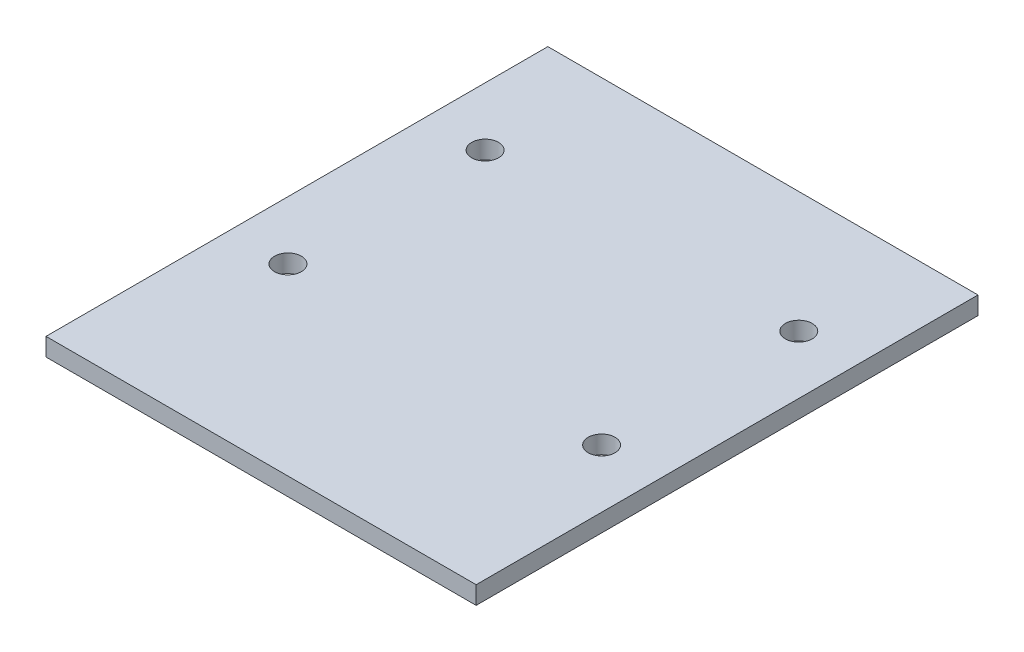
ISO-10303-21;
HEADER;
FILE_DESCRIPTION(('STEP AP214'),'2;1');
FILE_NAME('part.step','',(''),(''),'','','');
FILE_SCHEMA(('AUTOMOTIVE_DESIGN { 1 0 10303 214 1 1 1 1 }'));
ENDSEC;
DATA;
#1=APPLICATION_CONTEXT('core data for automotive mechanical design processes');
#2=APPLICATION_PROTOCOL_DEFINITION('international standard','automotive_design',2000,#1);
#3=PRODUCT_CONTEXT('',#1,'mechanical');
#4=PRODUCT('Part','Part','',(#3));
#5=PRODUCT_RELATED_PRODUCT_CATEGORY('part','',(#4));
#6=PRODUCT_DEFINITION_FORMATION('','',#4);
#7=PRODUCT_DEFINITION_CONTEXT('part definition',#1,'design');
#8=PRODUCT_DEFINITION('design','',#6,#7);
#9=PRODUCT_DEFINITION_SHAPE('','',#8);
#10=(LENGTH_UNIT() NAMED_UNIT(*) SI_UNIT(.MILLI.,.METRE.));
#11=(NAMED_UNIT(*) PLANE_ANGLE_UNIT() SI_UNIT($,.RADIAN.));
#12=(NAMED_UNIT(*) SI_UNIT($,.STERADIAN.) SOLID_ANGLE_UNIT());
#13=UNCERTAINTY_MEASURE_WITH_UNIT(LENGTH_MEASURE(1.E-05),#10,'distance_accuracy_value','');
#14=(GEOMETRIC_REPRESENTATION_CONTEXT(3) GLOBAL_UNCERTAINTY_ASSIGNED_CONTEXT((#13)) GLOBAL_UNIT_ASSIGNED_CONTEXT((#10,
#11,#12)) REPRESENTATION_CONTEXT('',''));
#15=CARTESIAN_POINT('',(0.,0.,0.));
#16=DIRECTION('',(0.,0.,1.));
#17=DIRECTION('',(1.,0.,0.));
#18=AXIS2_PLACEMENT_3D('',#15,#16,#17);
#19=CARTESIAN_POINT('',(-76.2,3.175,88.9));
#20=DIRECTION('',(1.,0.,0.));
#21=DIRECTION('',(0.,0.,-1.));
#22=AXIS2_PLACEMENT_3D('',#19,#20,#21);
#23=PLANE('',#22);
#24=DIRECTION('',(0.,0.,1.));
#25=VECTOR('',#24,1.);
#26=CARTESIAN_POINT('',(-76.2,-3.175,88.9));
#27=LINE('',#26,#25);
#28=CARTESIAN_POINT('',(-76.2,-3.175,-88.9));
#29=VERTEX_POINT('',#28);
#30=CARTESIAN_POINT('',(-76.2,-3.175,88.9));
#31=VERTEX_POINT('',#30);
#32=EDGE_CURVE('E96',#29,#31,#27,.T.);
#33=ORIENTED_EDGE('',*,*,#32,.T.);
#34=DIRECTION('',(0.,-1.,0.));
#35=VECTOR('',#34,1.);
#36=CARTESIAN_POINT('',(-76.2,3.175,88.9));
#37=LINE('',#36,#35);
#38=CARTESIAN_POINT('',(-76.2,3.175,88.9));
#39=VERTEX_POINT('',#38);
#40=EDGE_CURVE('E11',#39,#31,#37,.T.);
#41=ORIENTED_EDGE('',*,*,#40,.F.);
#42=DIRECTION('',(0.,0.,1.));
#43=VECTOR('',#42,1.);
#44=CARTESIAN_POINT('',(-76.2,3.175,88.9));
#45=LINE('',#44,#43);
#46=CARTESIAN_POINT('',(-76.2,3.175,-88.9));
#47=VERTEX_POINT('',#46);
#48=EDGE_CURVE('E84',#47,#39,#45,.T.);
#49=ORIENTED_EDGE('',*,*,#48,.F.);
#50=DIRECTION('',(0.,-1.,0.));
#51=VECTOR('',#50,1.);
#52=CARTESIAN_POINT('',(-76.2,3.175,-88.9));
#53=LINE('',#52,#51);
#54=EDGE_CURVE('E92',#47,#29,#53,.T.);
#55=ORIENTED_EDGE('',*,*,#54,.T.);
#56=EDGE_LOOP('',(#33,#41,#49,#55));
#57=FACE_BOUND('',#56,.T.);
#58=ADVANCED_FACE('F33',(#57),#23,.F.);
#59=CARTESIAN_POINT('',(76.2,3.175,88.9));
#60=DIRECTION('',(0.,0.,-1.));
#61=DIRECTION('',(-1.,0.,0.));
#62=AXIS2_PLACEMENT_3D('',#59,#60,#61);
#63=PLANE('',#62);
#64=DIRECTION('',(1.,0.,0.));
#65=VECTOR('',#64,1.);
#66=CARTESIAN_POINT('',(76.2,-3.175,88.9));
#67=LINE('',#66,#65);
#68=CARTESIAN_POINT('',(76.2,-3.175,88.9));
#69=VERTEX_POINT('',#68);
#70=EDGE_CURVE('E88',#31,#69,#67,.T.);
#71=ORIENTED_EDGE('',*,*,#70,.T.);
#72=DIRECTION('',(0.,-1.,0.));
#73=VECTOR('',#72,1.);
#74=CARTESIAN_POINT('',(76.2,3.175,88.9));
#75=LINE('',#74,#73);
#76=CARTESIAN_POINT('',(76.2,3.175,88.9));
#77=VERTEX_POINT('',#76);
#78=EDGE_CURVE('E41',#77,#69,#75,.T.);
#79=ORIENTED_EDGE('',*,*,#78,.F.);
#80=DIRECTION('',(1.,0.,0.));
#81=VECTOR('',#80,1.);
#82=CARTESIAN_POINT('',(76.2,3.175,88.9));
#83=LINE('',#82,#81);
#84=EDGE_CURVE('E79',#39,#77,#83,.T.);
#85=ORIENTED_EDGE('',*,*,#84,.F.);
#86=ORIENTED_EDGE('',*,*,#40,.T.);
#87=EDGE_LOOP('',(#71,#79,#85,#86));
#88=FACE_BOUND('',#87,.T.);
#89=ADVANCED_FACE('F87',(#88),#63,.F.);
#90=CARTESIAN_POINT('',(76.2,3.175,88.9));
#91=DIRECTION('',(-1.,0.,0.));
#92=DIRECTION('',(0.,0.,1.));
#93=AXIS2_PLACEMENT_3D('',#90,#91,#92);
#94=PLANE('',#93);
#95=DIRECTION('',(0.,0.,-1.));
#96=VECTOR('',#95,1.);
#97=CARTESIAN_POINT('',(76.2,-3.175,88.9));
#98=LINE('',#97,#96);
#99=CARTESIAN_POINT('',(76.2,-3.175,-88.9));
#100=VERTEX_POINT('',#99);
#101=EDGE_CURVE('E66',#69,#100,#98,.T.);
#102=ORIENTED_EDGE('',*,*,#101,.T.);
#103=DIRECTION('',(0.,-1.,0.));
#104=VECTOR('',#103,1.);
#105=CARTESIAN_POINT('',(76.2,3.175,-88.9));
#106=LINE('',#105,#104);
#107=CARTESIAN_POINT('',(76.2,3.175,-88.9));
#108=VERTEX_POINT('',#107);
#109=EDGE_CURVE('E89',#108,#100,#106,.T.);
#110=ORIENTED_EDGE('',*,*,#109,.F.);
#111=DIRECTION('',(0.,0.,-1.));
#112=VECTOR('',#111,1.);
#113=CARTESIAN_POINT('',(76.2,3.175,88.9));
#114=LINE('',#113,#112);
#115=EDGE_CURVE('E82',#77,#108,#114,.T.);
#116=ORIENTED_EDGE('',*,*,#115,.F.);
#117=ORIENTED_EDGE('',*,*,#78,.T.);
#118=EDGE_LOOP('',(#102,#110,#116,#117));
#119=FACE_BOUND('',#118,.T.);
#120=ADVANCED_FACE('F90',(#119),#94,.F.);
#121=CARTESIAN_POINT('',(76.2,3.175,-88.9));
#122=DIRECTION('',(0.,0.,1.));
#123=DIRECTION('',(1.,0.,0.));
#124=AXIS2_PLACEMENT_3D('',#121,#122,#123);
#125=PLANE('',#124);
#126=DIRECTION('',(-1.,0.,0.));
#127=VECTOR('',#126,1.);
#128=CARTESIAN_POINT('',(76.2,-3.175,-88.9));
#129=LINE('',#128,#127);
#130=EDGE_CURVE('E72',#100,#29,#129,.T.);
#131=ORIENTED_EDGE('',*,*,#130,.T.);
#132=ORIENTED_EDGE('',*,*,#54,.F.);
#133=DIRECTION('',(-1.,0.,0.));
#134=VECTOR('',#133,1.);
#135=CARTESIAN_POINT('',(76.2,3.175,-88.9));
#136=LINE('',#135,#134);
#137=EDGE_CURVE('E49',#108,#47,#136,.T.);
#138=ORIENTED_EDGE('',*,*,#137,.F.);
#139=ORIENTED_EDGE('',*,*,#109,.T.);
#140=EDGE_LOOP('',(#131,#132,#138,#139));
#141=FACE_BOUND('',#140,.T.);
#142=ADVANCED_FACE('F104',(#141),#125,.F.);
#143=CARTESIAN_POINT('',(0.,3.175,0.));
#144=DIRECTION('',(0.,1.,0.));
#145=DIRECTION('',(0.,0.,1.));
#146=AXIS2_PLACEMENT_3D('',#143,#144,#145);
#147=PLANE('',#146);
#148=CARTESIAN_POINT('',(-55.5625000000007,3.175,-46.0375000000013));
#149=DIRECTION('',(0.,1.,0.));
#150=DIRECTION('',(0.,0.,1.));
#151=AXIS2_PLACEMENT_3D('',#148,#149,#150);
#152=CIRCLE('',#151,4.7625);
#153=CARTESIAN_POINT('',(-55.5625000000007,3.175,-41.2750000000013));
#154=VERTEX_POINT('',#153);
#155=EDGE_CURVE('E130',#154,#154,#152,.T.);
#156=ORIENTED_EDGE('',*,*,#155,.F.);
#157=EDGE_LOOP('',(#156));
#158=FACE_BOUND('',#157,.T.);
#159=CARTESIAN_POINT('',(-55.5625000000007,3.175,23.8124999999984));
#160=DIRECTION('',(0.,1.,0.));
#161=DIRECTION('',(0.,0.,1.));
#162=AXIS2_PLACEMENT_3D('',#159,#160,#161);
#163=CIRCLE('',#162,4.7625);
#164=CARTESIAN_POINT('',(-55.5625000000007,3.175,28.5749999999984));
#165=VERTEX_POINT('',#164);
#166=EDGE_CURVE('E124',#165,#165,#163,.T.);
#167=ORIENTED_EDGE('',*,*,#166,.F.);
#168=EDGE_LOOP('',(#167));
#169=FACE_BOUND('',#168,.T.);
#170=CARTESIAN_POINT('',(55.5625000000007,3.175,23.8124999999984));
#171=DIRECTION('',(0.,1.,0.));
#172=DIRECTION('',(0.,0.,1.));
#173=AXIS2_PLACEMENT_3D('',#170,#171,#172);
#174=CIRCLE('',#173,4.7625);
#175=CARTESIAN_POINT('',(55.5625000000007,3.175,28.5749999999984));
#176=VERTEX_POINT('',#175);
#177=EDGE_CURVE('E118',#176,#176,#174,.T.);
#178=ORIENTED_EDGE('',*,*,#177,.F.);
#179=EDGE_LOOP('',(#178));
#180=FACE_BOUND('',#179,.T.);
#181=CARTESIAN_POINT('',(55.5625000000007,3.175,-46.0375000000013));
#182=DIRECTION('',(0.,1.,0.));
#183=DIRECTION('',(0.,0.,1.));
#184=AXIS2_PLACEMENT_3D('',#181,#182,#183);
#185=CIRCLE('',#184,4.7625);
#186=CARTESIAN_POINT('',(55.5625000000007,3.175,-41.2750000000013));
#187=VERTEX_POINT('',#186);
#188=EDGE_CURVE('E112',#187,#187,#185,.T.);
#189=ORIENTED_EDGE('',*,*,#188,.F.);
#190=EDGE_LOOP('',(#189));
#191=FACE_BOUND('',#190,.T.);
#192=ORIENTED_EDGE('',*,*,#48,.T.);
#193=ORIENTED_EDGE('',*,*,#84,.T.);
#194=ORIENTED_EDGE('',*,*,#115,.T.);
#195=ORIENTED_EDGE('',*,*,#137,.T.);
#196=EDGE_LOOP('',(#192,#193,#194,#195));
#197=FACE_BOUND('',#196,.T.);
#198=ADVANCED_FACE('F80',(#158,#169,#180,#191,#197),#147,.T.);
#199=CARTESIAN_POINT('',(0.,-3.175,0.));
#200=DIRECTION('',(0.,1.,0.));
#201=DIRECTION('',(0.,0.,1.));
#202=AXIS2_PLACEMENT_3D('',#199,#200,#201);
#203=PLANE('',#202);
#204=CARTESIAN_POINT('',(-55.5625000000007,-3.175,-46.0375000000013));
#205=DIRECTION('',(0.,1.,0.));
#206=DIRECTION('',(0.,0.,1.));
#207=AXIS2_PLACEMENT_3D('',#204,#205,#206);
#208=CIRCLE('',#207,4.7625);
#209=CARTESIAN_POINT('',(-55.5625000000007,-3.175,-41.2750000000013));
#210=VERTEX_POINT('',#209);
#211=EDGE_CURVE('E127',#210,#210,#208,.T.);
#212=ORIENTED_EDGE('',*,*,#211,.T.);
#213=EDGE_LOOP('',(#212));
#214=FACE_BOUND('',#213,.T.);
#215=CARTESIAN_POINT('',(-55.5625000000007,-3.175,23.8124999999984));
#216=DIRECTION('',(0.,1.,0.));
#217=DIRECTION('',(0.,0.,1.));
#218=AXIS2_PLACEMENT_3D('',#215,#216,#217);
#219=CIRCLE('',#218,4.7625);
#220=CARTESIAN_POINT('',(-55.5625000000007,-3.175,28.5749999999984));
#221=VERTEX_POINT('',#220);
#222=EDGE_CURVE('E121',#221,#221,#219,.T.);
#223=ORIENTED_EDGE('',*,*,#222,.T.);
#224=EDGE_LOOP('',(#223));
#225=FACE_BOUND('',#224,.T.);
#226=CARTESIAN_POINT('',(55.5625000000007,-3.175,23.8124999999984));
#227=DIRECTION('',(0.,1.,0.));
#228=DIRECTION('',(0.,0.,1.));
#229=AXIS2_PLACEMENT_3D('',#226,#227,#228);
#230=CIRCLE('',#229,4.7625);
#231=CARTESIAN_POINT('',(55.5625000000007,-3.175,28.5749999999984));
#232=VERTEX_POINT('',#231);
#233=EDGE_CURVE('E115',#232,#232,#230,.T.);
#234=ORIENTED_EDGE('',*,*,#233,.T.);
#235=EDGE_LOOP('',(#234));
#236=FACE_BOUND('',#235,.T.);
#237=CARTESIAN_POINT('',(55.5625000000007,-3.175,-46.0375000000013));
#238=DIRECTION('',(0.,1.,0.));
#239=DIRECTION('',(0.,0.,1.));
#240=AXIS2_PLACEMENT_3D('',#237,#238,#239);
#241=CIRCLE('',#240,4.7625);
#242=CARTESIAN_POINT('',(55.5625000000007,-3.175,-41.2750000000013));
#243=VERTEX_POINT('',#242);
#244=EDGE_CURVE('E99',#243,#243,#241,.T.);
#245=ORIENTED_EDGE('',*,*,#244,.T.);
#246=EDGE_LOOP('',(#245));
#247=FACE_BOUND('',#246,.T.);
#248=ORIENTED_EDGE('',*,*,#32,.F.);
#249=ORIENTED_EDGE('',*,*,#130,.F.);
#250=ORIENTED_EDGE('',*,*,#101,.F.);
#251=ORIENTED_EDGE('',*,*,#70,.F.);
#252=EDGE_LOOP('',(#248,#249,#250,#251));
#253=FACE_BOUND('',#252,.T.);
#254=ADVANCED_FACE('F107',(#214,#225,#236,#247,#253),#203,.F.);
#255=CARTESIAN_POINT('',(55.5625000000007,3.175,-46.0375000000013));
#256=DIRECTION('',(0.,1.,0.));
#257=DIRECTION('',(0.,0.,1.));
#258=AXIS2_PLACEMENT_3D('',#255,#256,#257);
#259=CYLINDRICAL_SURFACE('',#258,4.7625);
#260=ORIENTED_EDGE('',*,*,#244,.F.);
#261=EDGE_LOOP('',(#260));
#262=FACE_BOUND('',#261,.T.);
#263=ORIENTED_EDGE('',*,*,#188,.T.);
#264=EDGE_LOOP('',(#263));
#265=FACE_BOUND('',#264,.T.);
#266=ADVANCED_FACE('F145',(#262,#265),#259,.F.);
#267=CARTESIAN_POINT('',(55.5625000000007,3.175,23.8124999999984));
#268=DIRECTION('',(0.,1.,0.));
#269=DIRECTION('',(0.,0.,1.));
#270=AXIS2_PLACEMENT_3D('',#267,#268,#269);
#271=CYLINDRICAL_SURFACE('',#270,4.7625);
#272=ORIENTED_EDGE('',*,*,#233,.F.);
#273=EDGE_LOOP('',(#272));
#274=FACE_BOUND('',#273,.T.);
#275=ORIENTED_EDGE('',*,*,#177,.T.);
#276=EDGE_LOOP('',(#275));
#277=FACE_BOUND('',#276,.T.);
#278=ADVANCED_FACE('F147',(#274,#277),#271,.F.);
#279=CARTESIAN_POINT('',(-55.5625000000007,3.175,23.8124999999984));
#280=DIRECTION('',(0.,1.,0.));
#281=DIRECTION('',(0.,0.,1.));
#282=AXIS2_PLACEMENT_3D('',#279,#280,#281);
#283=CYLINDRICAL_SURFACE('',#282,4.7625);
#284=ORIENTED_EDGE('',*,*,#222,.F.);
#285=EDGE_LOOP('',(#284));
#286=FACE_BOUND('',#285,.T.);
#287=ORIENTED_EDGE('',*,*,#166,.T.);
#288=EDGE_LOOP('',(#287));
#289=FACE_BOUND('',#288,.T.);
#290=ADVANCED_FACE('F154',(#286,#289),#283,.F.);
#291=CARTESIAN_POINT('',(-55.5625000000007,3.175,-46.0375000000013));
#292=DIRECTION('',(0.,1.,0.));
#293=DIRECTION('',(0.,0.,1.));
#294=AXIS2_PLACEMENT_3D('',#291,#292,#293);
#295=CYLINDRICAL_SURFACE('',#294,4.7625);
#296=ORIENTED_EDGE('',*,*,#211,.F.);
#297=EDGE_LOOP('',(#296));
#298=FACE_BOUND('',#297,.T.);
#299=ORIENTED_EDGE('',*,*,#155,.T.);
#300=EDGE_LOOP('',(#299));
#301=FACE_BOUND('',#300,.T.);
#302=ADVANCED_FACE('F134',(#298,#301),#295,.F.);
#303=CLOSED_SHELL('',(#58,#89,#120,#142,#198,#254,#266,#278,#290,#302));
#304=MANIFOLD_SOLID_BREP('B2',#303);
#305=ADVANCED_BREP_SHAPE_REPRESENTATION('',(#18,#304),#14);
#306=SHAPE_DEFINITION_REPRESENTATION(#9,#305);
ENDSEC;
END-ISO-10303-21;
